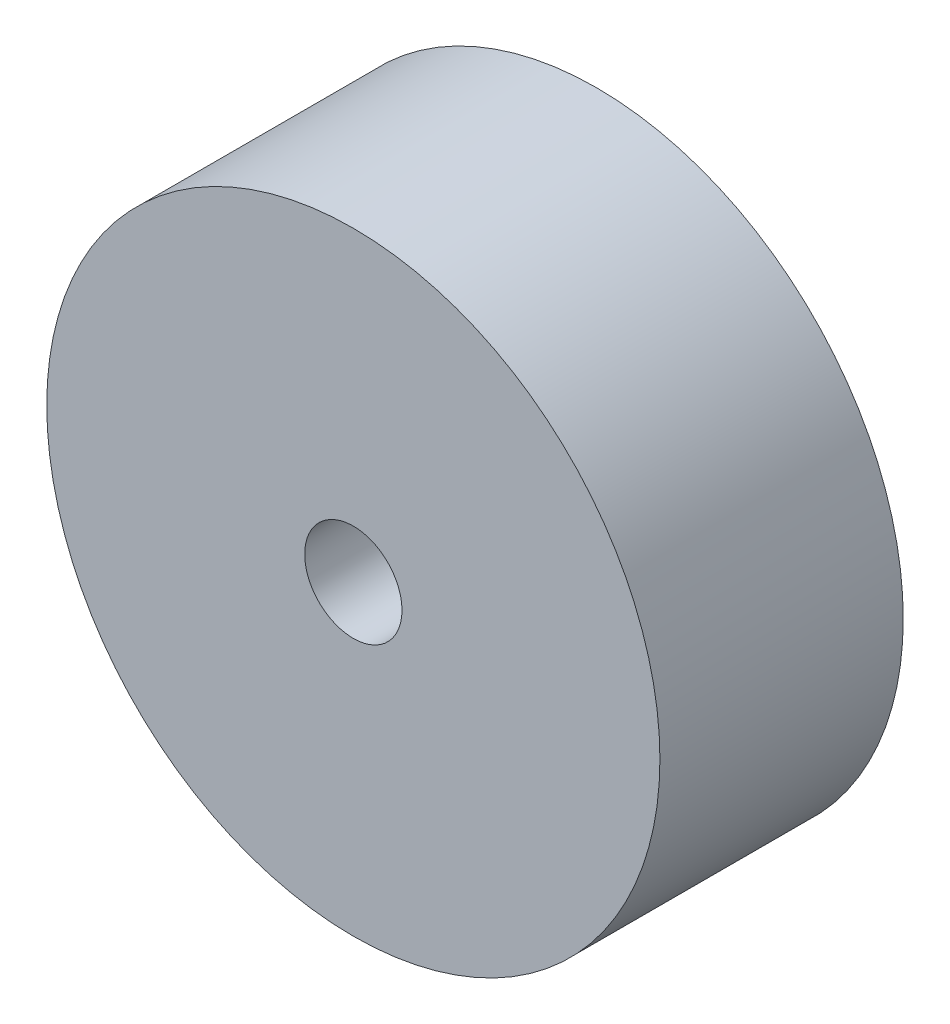
ISO-10303-21;
HEADER;
FILE_DESCRIPTION(('STEP AP214'),'2;1');
FILE_NAME('part.step','',(''),(''),'','','');
FILE_SCHEMA(('AUTOMOTIVE_DESIGN { 1 0 10303 214 1 1 1 1 }'));
ENDSEC;
DATA;
#1=APPLICATION_CONTEXT('core data for automotive mechanical design processes');
#2=APPLICATION_PROTOCOL_DEFINITION('international standard','automotive_design',2000,#1);
#3=PRODUCT_CONTEXT('',#1,'mechanical');
#4=PRODUCT('Part','Part','',(#3));
#5=PRODUCT_RELATED_PRODUCT_CATEGORY('part','',(#4));
#6=PRODUCT_DEFINITION_FORMATION('','',#4);
#7=PRODUCT_DEFINITION_CONTEXT('part definition',#1,'design');
#8=PRODUCT_DEFINITION('design','',#6,#7);
#9=PRODUCT_DEFINITION_SHAPE('','',#8);
#10=(LENGTH_UNIT() NAMED_UNIT(*) SI_UNIT(.MILLI.,.METRE.));
#11=(NAMED_UNIT(*) PLANE_ANGLE_UNIT() SI_UNIT($,.RADIAN.));
#12=(NAMED_UNIT(*) SI_UNIT($,.STERADIAN.) SOLID_ANGLE_UNIT());
#13=UNCERTAINTY_MEASURE_WITH_UNIT(LENGTH_MEASURE(1.E-05),#10,'distance_accuracy_value','');
#14=(GEOMETRIC_REPRESENTATION_CONTEXT(3) GLOBAL_UNCERTAINTY_ASSIGNED_CONTEXT((#13)) GLOBAL_UNIT_ASSIGNED_CONTEXT((#10,
#11,#12)) REPRESENTATION_CONTEXT('',''));
#15=CARTESIAN_POINT('',(0.,0.,0.));
#16=DIRECTION('',(0.,0.,1.));
#17=DIRECTION('',(1.,0.,0.));
#18=AXIS2_PLACEMENT_3D('',#15,#16,#17);
#19=CARTESIAN_POINT('',(0.,0.,25.));
#20=DIRECTION('',(0.,0.,1.));
#21=DIRECTION('',(1.,0.,0.));
#22=AXIS2_PLACEMENT_3D('',#19,#20,#21);
#23=PLANE('',#22);
#24=CARTESIAN_POINT('',(0.,0.,25.));
#25=DIRECTION('',(0.,0.,1.));
#26=DIRECTION('',(1.,0.,0.));
#27=AXIS2_PLACEMENT_3D('',#24,#25,#26);
#28=CIRCLE('',#27,31.5);
#29=CARTESIAN_POINT('',(31.5,0.,25.));
#30=VERTEX_POINT('',#29);
#31=EDGE_CURVE('E10',#30,#30,#28,.T.);
#32=ORIENTED_EDGE('',*,*,#31,.T.);
#33=EDGE_LOOP('',(#32));
#34=FACE_BOUND('',#33,.T.);
#35=CARTESIAN_POINT('',(0.,0.,25.));
#36=DIRECTION('',(0.,0.,1.));
#37=DIRECTION('',(1.,0.,0.));
#38=AXIS2_PLACEMENT_3D('',#35,#36,#37);
#39=CIRCLE('',#38,5.);
#40=CARTESIAN_POINT('',(5.,0.,25.));
#41=VERTEX_POINT('',#40);
#42=EDGE_CURVE('E37',#41,#41,#39,.T.);
#43=ORIENTED_EDGE('',*,*,#42,.F.);
#44=EDGE_LOOP('',(#43));
#45=FACE_BOUND('',#44,.T.);
#46=ADVANCED_FACE('F26',(#34,#45),#23,.T.);
#47=CARTESIAN_POINT('',(0.,0.,0.));
#48=DIRECTION('',(0.,0.,1.));
#49=DIRECTION('',(1.,0.,0.));
#50=AXIS2_PLACEMENT_3D('',#47,#48,#49);
#51=PLANE('',#50);
#52=CARTESIAN_POINT('',(0.,0.,0.));
#53=DIRECTION('',(0.,0.,1.));
#54=DIRECTION('',(1.,0.,0.));
#55=AXIS2_PLACEMENT_3D('',#52,#53,#54);
#56=CIRCLE('',#55,31.5);
#57=CARTESIAN_POINT('',(31.5,0.,0.));
#58=VERTEX_POINT('',#57);
#59=EDGE_CURVE('E33',#58,#58,#56,.T.);
#60=ORIENTED_EDGE('',*,*,#59,.F.);
#61=EDGE_LOOP('',(#60));
#62=FACE_BOUND('',#61,.T.);
#63=CARTESIAN_POINT('',(0.,0.,0.));
#64=DIRECTION('',(0.,0.,1.));
#65=DIRECTION('',(1.,0.,0.));
#66=AXIS2_PLACEMENT_3D('',#63,#64,#65);
#67=CIRCLE('',#66,5.);
#68=CARTESIAN_POINT('',(5.,0.,0.));
#69=VERTEX_POINT('',#68);
#70=EDGE_CURVE('E41',#69,#69,#67,.T.);
#71=ORIENTED_EDGE('',*,*,#70,.T.);
#72=EDGE_LOOP('',(#71));
#73=FACE_BOUND('',#72,.T.);
#74=ADVANCED_FACE('F47',(#62,#73),#51,.F.);
#75=CARTESIAN_POINT('',(0.,0.,25.));
#76=DIRECTION('',(0.,0.,-1.));
#77=DIRECTION('',(-1.,0.,0.));
#78=AXIS2_PLACEMENT_3D('',#75,#76,#77);
#79=CYLINDRICAL_SURFACE('',#78,31.5);
#80=ORIENTED_EDGE('',*,*,#31,.F.);
#81=EDGE_LOOP('',(#80));
#82=FACE_BOUND('',#81,.T.);
#83=ORIENTED_EDGE('',*,*,#59,.T.);
#84=EDGE_LOOP('',(#83));
#85=FACE_BOUND('',#84,.T.);
#86=ADVANCED_FACE('F28',(#82,#85),#79,.T.);
#87=CARTESIAN_POINT('',(0.,0.,25.));
#88=DIRECTION('',(0.,0.,-1.));
#89=DIRECTION('',(-1.,0.,0.));
#90=AXIS2_PLACEMENT_3D('',#87,#88,#89);
#91=CYLINDRICAL_SURFACE('',#90,5.);
#92=ORIENTED_EDGE('',*,*,#42,.T.);
#93=EDGE_LOOP('',(#92));
#94=FACE_BOUND('',#93,.T.);
#95=ORIENTED_EDGE('',*,*,#70,.F.);
#96=EDGE_LOOP('',(#95));
#97=FACE_BOUND('',#96,.T.);
#98=ADVANCED_FACE('F49',(#94,#97),#91,.F.);
#99=CLOSED_SHELL('',(#46,#74,#86,#98));
#100=MANIFOLD_SOLID_BREP('B2',#99);
#101=ADVANCED_BREP_SHAPE_REPRESENTATION('',(#18,#100),#14);
#102=SHAPE_DEFINITION_REPRESENTATION(#9,#101);
ENDSEC;
END-ISO-10303-21;
